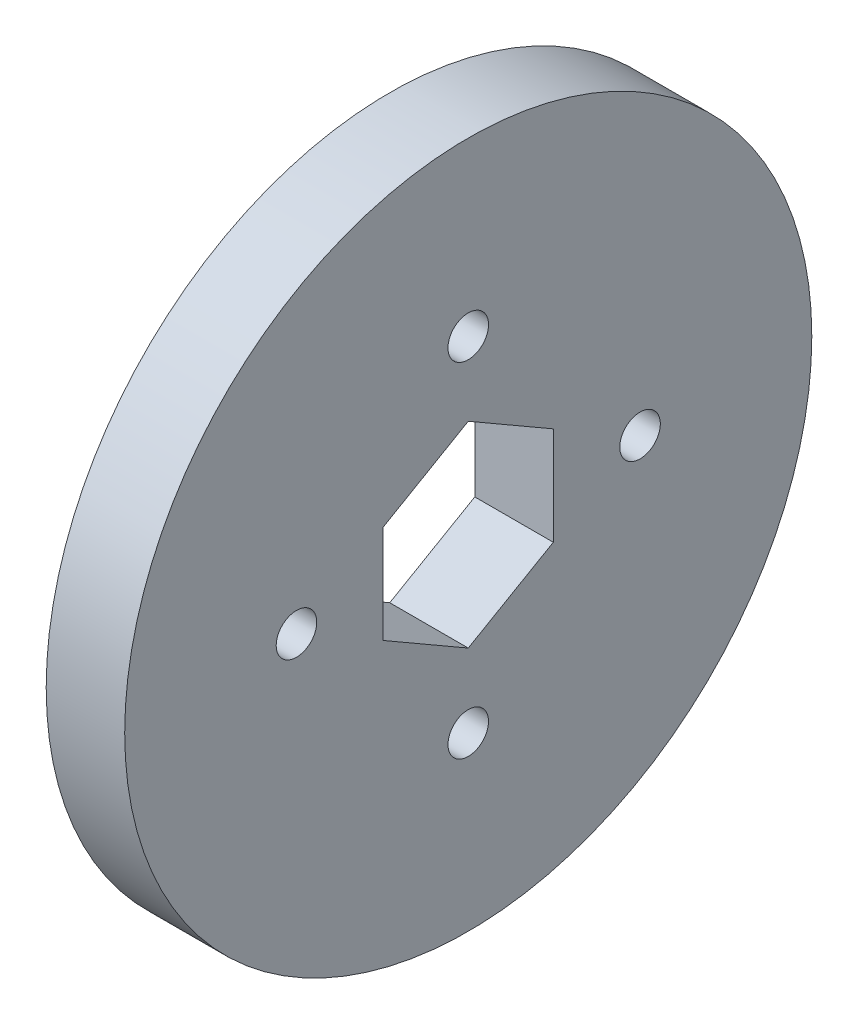
ISO-10303-21;
HEADER;
FILE_DESCRIPTION(('STEP AP214'),'2;1');
FILE_NAME('part.step','',(''),(''),'','','');
FILE_SCHEMA(('AUTOMOTIVE_DESIGN { 1 0 10303 214 1 1 1 1 }'));
ENDSEC;
DATA;
#1=APPLICATION_CONTEXT('core data for automotive mechanical design processes');
#2=APPLICATION_PROTOCOL_DEFINITION('international standard','automotive_design',2000,#1);
#3=PRODUCT_CONTEXT('',#1,'mechanical');
#4=PRODUCT('Part','Part','',(#3));
#5=PRODUCT_RELATED_PRODUCT_CATEGORY('part','',(#4));
#6=PRODUCT_DEFINITION_FORMATION('','',#4);
#7=PRODUCT_DEFINITION_CONTEXT('part definition',#1,'design');
#8=PRODUCT_DEFINITION('design','',#6,#7);
#9=PRODUCT_DEFINITION_SHAPE('','',#8);
#10=(LENGTH_UNIT() NAMED_UNIT(*) SI_UNIT(.MILLI.,.METRE.));
#11=(NAMED_UNIT(*) PLANE_ANGLE_UNIT() SI_UNIT($,.RADIAN.));
#12=(NAMED_UNIT(*) SI_UNIT($,.STERADIAN.) SOLID_ANGLE_UNIT());
#13=UNCERTAINTY_MEASURE_WITH_UNIT(LENGTH_MEASURE(1.E-05),#10,'distance_accuracy_value','');
#14=(GEOMETRIC_REPRESENTATION_CONTEXT(3) GLOBAL_UNCERTAINTY_ASSIGNED_CONTEXT((#13)) GLOBAL_UNIT_ASSIGNED_CONTEXT((#10,
#11,#12)) REPRESENTATION_CONTEXT('',''));
#15=CARTESIAN_POINT('',(0.,0.,0.));
#16=DIRECTION('',(0.,0.,1.));
#17=DIRECTION('',(1.,0.,0.));
#18=AXIS2_PLACEMENT_3D('',#15,#16,#17);
#19=CARTESIAN_POINT('',(-6.,-58.5459620006682,16.0977600055791));
#20=DIRECTION('',(-1.,0.,0.));
#21=DIRECTION('',(0.,0.,1.));
#22=AXIS2_PLACEMENT_3D('',#19,#20,#21);
#23=PLANE('',#22);
#24=CARTESIAN_POINT('',(-6.,-58.5459620006684,2.96898563883479));
#25=DIRECTION('',(-1.,0.,0.));
#26=DIRECTION('',(0.,0.,1.));
#27=AXIS2_PLACEMENT_3D('',#24,#25,#26);
#28=CIRCLE('',#27,1.54999999999999);
#29=CARTESIAN_POINT('',(-6.,-58.5459620006684,4.51898563883478));
#30=VERTEX_POINT('',#29);
#31=EDGE_CURVE('E142',#30,#30,#28,.T.);
#32=ORIENTED_EDGE('',*,*,#31,.F.);
#33=EDGE_LOOP('',(#32));
#34=FACE_BOUND('',#33,.T.);
#35=CARTESIAN_POINT('',(-6.,-58.5459620006679,29.2265343723235));
#36=DIRECTION('',(-1.,0.,0.));
#37=DIRECTION('',(0.,0.,1.));
#38=AXIS2_PLACEMENT_3D('',#35,#36,#37);
#39=CIRCLE('',#38,1.55000000000001);
#40=CARTESIAN_POINT('',(-6.,-58.5459620006679,30.7765343723235));
#41=VERTEX_POINT('',#40);
#42=EDGE_CURVE('E154',#41,#41,#39,.T.);
#43=ORIENTED_EDGE('',*,*,#42,.F.);
#44=EDGE_LOOP('',(#43));
#45=FACE_BOUND('',#44,.T.);
#46=CARTESIAN_POINT('',(-6.,-58.5459620006682,16.0977600055791));
#47=DIRECTION('',(-1.,0.,0.));
#48=DIRECTION('',(0.,0.,1.));
#49=AXIS2_PLACEMENT_3D('',#46,#47,#48);
#50=CIRCLE('',#49,26.2575490314848);
#51=CARTESIAN_POINT('',(-6.,-58.5459620006682,42.3553090370639));
#52=VERTEX_POINT('',#51);
#53=EDGE_CURVE('E11',#52,#52,#50,.T.);
#54=ORIENTED_EDGE('',*,*,#53,.T.);
#55=EDGE_LOOP('',(#54));
#56=FACE_BOUND('',#55,.T.);
#57=CARTESIAN_POINT('',(-6.,-45.4171876339238,16.0977600055789));
#58=DIRECTION('',(-1.,0.,0.));
#59=DIRECTION('',(0.,0.,1.));
#60=AXIS2_PLACEMENT_3D('',#57,#58,#59);
#61=CIRCLE('',#60,1.54999999999999);
#62=CARTESIAN_POINT('',(-6.,-45.4171876339238,17.6477600055789));
#63=VERTEX_POINT('',#62);
#64=EDGE_CURVE('E148',#63,#63,#61,.T.);
#65=ORIENTED_EDGE('',*,*,#64,.F.);
#66=EDGE_LOOP('',(#65));
#67=FACE_BOUND('',#66,.T.);
#68=CARTESIAN_POINT('',(-6.,-71.6747363674125,16.0977600055793));
#69=DIRECTION('',(-1.,0.,0.));
#70=DIRECTION('',(0.,0.,1.));
#71=AXIS2_PLACEMENT_3D('',#68,#69,#70);
#72=CIRCLE('',#71,1.55);
#73=CARTESIAN_POINT('',(-6.,-71.6747363674125,17.6477600055793));
#74=VERTEX_POINT('',#73);
#75=EDGE_CURVE('E136',#74,#74,#72,.T.);
#76=ORIENTED_EDGE('',*,*,#75,.F.);
#77=EDGE_LOOP('',(#76));
#78=FACE_BOUND('',#77,.T.);
#79=DIRECTION('',(0.,-0.500000000000014,-0.866025403784431));
#80=VECTOR('',#79,1.);
#81=CARTESIAN_POINT('',(-6.,-51.040408501203,16.097760005579));
#82=LINE('',#81,#80);
#83=CARTESIAN_POINT('',(-6.,-51.040408501203,16.097760005579));
#84=VERTEX_POINT('',#83);
#85=CARTESIAN_POINT('',(-6.,-54.7931852509357,9.59776000557909));
#86=VERTEX_POINT('',#85);
#87=EDGE_CURVE('E93',#84,#86,#82,.T.);
#88=ORIENTED_EDGE('',*,*,#87,.F.);
#89=DIRECTION('',(0.,0.499999999999986,-0.866025403784447));
#90=VECTOR('',#89,1.);
#91=CARTESIAN_POINT('',(-6.,-54.7931852509355,22.5977600055791));
#92=LINE('',#91,#90);
#93=CARTESIAN_POINT('',(-6.,-54.7931852509355,22.5977600055791));
#94=VERTEX_POINT('',#93);
#95=EDGE_CURVE('E85',#94,#84,#92,.T.);
#96=ORIENTED_EDGE('',*,*,#95,.F.);
#97=DIRECTION('',(0.,1.,0.));
#98=VECTOR('',#97,1.);
#99=CARTESIAN_POINT('',(-6.,-62.2987387504006,22.5977600055792));
#100=LINE('',#99,#98);
#101=CARTESIAN_POINT('',(-6.,-62.2987387504006,22.5977600055792));
#102=VERTEX_POINT('',#101);
#103=EDGE_CURVE('E114',#102,#94,#100,.T.);
#104=ORIENTED_EDGE('',*,*,#103,.F.);
#105=DIRECTION('',(0.,0.500000000000014,0.866025403784431));
#106=VECTOR('',#105,1.);
#107=CARTESIAN_POINT('',(-6.,-66.0515155001333,16.0977600055793));
#108=LINE('',#107,#106);
#109=CARTESIAN_POINT('',(-6.,-66.0515155001333,16.0977600055793));
#110=VERTEX_POINT('',#109);
#111=EDGE_CURVE('E112',#110,#102,#108,.T.);
#112=ORIENTED_EDGE('',*,*,#111,.F.);
#113=DIRECTION('',(0.,-0.499999999999987,0.866025403784446));
#114=VECTOR('',#113,1.);
#115=CARTESIAN_POINT('',(-6.,-62.2987387504008,9.5977600055792));
#116=LINE('',#115,#114);
#117=CARTESIAN_POINT('',(-6.,-62.2987387504008,9.5977600055792));
#118=VERTEX_POINT('',#117);
#119=EDGE_CURVE('E108',#118,#110,#116,.T.);
#120=ORIENTED_EDGE('',*,*,#119,.F.);
#121=DIRECTION('',(0.,-1.,0.));
#122=VECTOR('',#121,1.);
#123=CARTESIAN_POINT('',(-6.,-54.7931852509357,9.59776000557909));
#124=LINE('',#123,#122);
#125=EDGE_CURVE('E106',#86,#118,#124,.T.);
#126=ORIENTED_EDGE('',*,*,#125,.F.);
#127=EDGE_LOOP('',(#88,#96,#104,#112,#120,#126));
#128=FACE_BOUND('',#127,.T.);
#129=ADVANCED_FACE('F32',(#34,#45,#56,#67,#78,#128),#23,.T.);
#130=CARTESIAN_POINT('',(0.,-58.5459620006682,16.0977600055791));
#131=DIRECTION('',(-1.,0.,0.));
#132=DIRECTION('',(0.,0.,1.));
#133=AXIS2_PLACEMENT_3D('',#130,#131,#132);
#134=PLANE('',#133);
#135=CARTESIAN_POINT('',(0.,-71.6747363674125,16.0977600055793));
#136=DIRECTION('',(-1.,0.,0.));
#137=DIRECTION('',(0.,0.,1.));
#138=AXIS2_PLACEMENT_3D('',#135,#136,#137);
#139=CIRCLE('',#138,1.55);
#140=CARTESIAN_POINT('',(0.,-71.6747363674125,17.6477600055793));
#141=VERTEX_POINT('',#140);
#142=EDGE_CURVE('E101',#141,#141,#139,.T.);
#143=ORIENTED_EDGE('',*,*,#142,.T.);
#144=EDGE_LOOP('',(#143));
#145=FACE_BOUND('',#144,.T.);
#146=CARTESIAN_POINT('',(0.,-58.5459620006684,2.96898563883479));
#147=DIRECTION('',(-1.,0.,0.));
#148=DIRECTION('',(0.,0.,1.));
#149=AXIS2_PLACEMENT_3D('',#146,#147,#148);
#150=CIRCLE('',#149,1.54999999999999);
#151=CARTESIAN_POINT('',(0.,-58.5459620006684,4.51898563883478));
#152=VERTEX_POINT('',#151);
#153=EDGE_CURVE('E139',#152,#152,#150,.T.);
#154=ORIENTED_EDGE('',*,*,#153,.T.);
#155=EDGE_LOOP('',(#154));
#156=FACE_BOUND('',#155,.T.);
#157=CARTESIAN_POINT('',(0.,-45.4171876339238,16.0977600055789));
#158=DIRECTION('',(-1.,0.,0.));
#159=DIRECTION('',(0.,0.,1.));
#160=AXIS2_PLACEMENT_3D('',#157,#158,#159);
#161=CIRCLE('',#160,1.54999999999999);
#162=CARTESIAN_POINT('',(0.,-45.4171876339238,17.6477600055789));
#163=VERTEX_POINT('',#162);
#164=EDGE_CURVE('E145',#163,#163,#161,.T.);
#165=ORIENTED_EDGE('',*,*,#164,.T.);
#166=EDGE_LOOP('',(#165));
#167=FACE_BOUND('',#166,.T.);
#168=CARTESIAN_POINT('',(0.,-58.5459620006679,29.2265343723235));
#169=DIRECTION('',(-1.,0.,0.));
#170=DIRECTION('',(0.,0.,1.));
#171=AXIS2_PLACEMENT_3D('',#168,#169,#170);
#172=CIRCLE('',#171,1.55000000000001);
#173=CARTESIAN_POINT('',(0.,-58.5459620006679,30.7765343723235));
#174=VERTEX_POINT('',#173);
#175=EDGE_CURVE('E151',#174,#174,#172,.T.);
#176=ORIENTED_EDGE('',*,*,#175,.T.);
#177=EDGE_LOOP('',(#176));
#178=FACE_BOUND('',#177,.T.);
#179=CARTESIAN_POINT('',(0.,-58.5459620006682,16.0977600055791));
#180=DIRECTION('',(-1.,0.,0.));
#181=DIRECTION('',(0.,0.,1.));
#182=AXIS2_PLACEMENT_3D('',#179,#180,#181);
#183=CIRCLE('',#182,26.2575490314848);
#184=CARTESIAN_POINT('',(0.,-58.5459620006682,42.3553090370639));
#185=VERTEX_POINT('',#184);
#186=EDGE_CURVE('E36',#185,#185,#183,.T.);
#187=ORIENTED_EDGE('',*,*,#186,.F.);
#188=EDGE_LOOP('',(#187));
#189=FACE_BOUND('',#188,.T.);
#190=DIRECTION('',(0.,0.499999999999986,-0.866025403784447));
#191=VECTOR('',#190,1.);
#192=CARTESIAN_POINT('',(0.,-54.7931852509355,22.5977600055791));
#193=LINE('',#192,#191);
#194=CARTESIAN_POINT('',(0.,-54.7931852509355,22.5977600055791));
#195=VERTEX_POINT('',#194);
#196=CARTESIAN_POINT('',(0.,-51.040408501203,16.097760005579));
#197=VERTEX_POINT('',#196);
#198=EDGE_CURVE('E55',#195,#197,#193,.T.);
#199=ORIENTED_EDGE('',*,*,#198,.T.);
#200=DIRECTION('',(0.,-0.500000000000014,-0.866025403784431));
#201=VECTOR('',#200,1.);
#202=CARTESIAN_POINT('',(0.,-51.040408501203,16.097760005579));
#203=LINE('',#202,#201);
#204=CARTESIAN_POINT('',(0.,-54.7931852509357,9.59776000557909));
#205=VERTEX_POINT('',#204);
#206=EDGE_CURVE('E100',#197,#205,#203,.T.);
#207=ORIENTED_EDGE('',*,*,#206,.T.);
#208=DIRECTION('',(0.,-1.,0.));
#209=VECTOR('',#208,1.);
#210=CARTESIAN_POINT('',(0.,-54.7931852509357,9.59776000557909));
#211=LINE('',#210,#209);
#212=CARTESIAN_POINT('',(0.,-62.2987387504008,9.5977600055792));
#213=VERTEX_POINT('',#212);
#214=EDGE_CURVE('E118',#205,#213,#211,.T.);
#215=ORIENTED_EDGE('',*,*,#214,.T.);
#216=DIRECTION('',(0.,-0.499999999999987,0.866025403784446));
#217=VECTOR('',#216,1.);
#218=CARTESIAN_POINT('',(0.,-62.2987387504008,9.5977600055792));
#219=LINE('',#218,#217);
#220=CARTESIAN_POINT('',(0.,-66.0515155001333,16.0977600055793));
#221=VERTEX_POINT('',#220);
#222=EDGE_CURVE('E121',#213,#221,#219,.T.);
#223=ORIENTED_EDGE('',*,*,#222,.T.);
#224=DIRECTION('',(0.,0.500000000000014,0.866025403784431));
#225=VECTOR('',#224,1.);
#226=CARTESIAN_POINT('',(0.,-66.0515155001333,16.0977600055793));
#227=LINE('',#226,#225);
#228=CARTESIAN_POINT('',(0.,-62.2987387504006,22.5977600055792));
#229=VERTEX_POINT('',#228);
#230=EDGE_CURVE('E124',#221,#229,#227,.T.);
#231=ORIENTED_EDGE('',*,*,#230,.T.);
#232=DIRECTION('',(0.,1.,0.));
#233=VECTOR('',#232,1.);
#234=CARTESIAN_POINT('',(0.,-62.2987387504006,22.5977600055792));
#235=LINE('',#234,#233);
#236=EDGE_CURVE('E94',#229,#195,#235,.T.);
#237=ORIENTED_EDGE('',*,*,#236,.T.);
#238=EDGE_LOOP('',(#199,#207,#215,#223,#231,#237));
#239=FACE_BOUND('',#238,.T.);
#240=ADVANCED_FACE('F160',(#145,#156,#167,#178,#189,#239),#134,.F.);
#241=CARTESIAN_POINT('',(-6.,-58.5459620006682,16.0977600055791));
#242=DIRECTION('',(1.,0.,0.));
#243=DIRECTION('',(0.,0.,-1.));
#244=AXIS2_PLACEMENT_3D('',#241,#242,#243);
#245=CYLINDRICAL_SURFACE('',#244,26.2575490314848);
#246=ORIENTED_EDGE('',*,*,#53,.F.);
#247=EDGE_LOOP('',(#246));
#248=FACE_BOUND('',#247,.T.);
#249=ORIENTED_EDGE('',*,*,#186,.T.);
#250=EDGE_LOOP('',(#249));
#251=FACE_BOUND('',#250,.T.);
#252=ADVANCED_FACE('F34',(#248,#251),#245,.T.);
#253=CARTESIAN_POINT('',(-6.,-58.5459620006679,29.2265343723235));
#254=DIRECTION('',(1.,0.,0.));
#255=DIRECTION('',(0.,0.,-1.));
#256=AXIS2_PLACEMENT_3D('',#253,#254,#255);
#257=CYLINDRICAL_SURFACE('',#256,1.55000000000001);
#258=ORIENTED_EDGE('',*,*,#42,.T.);
#259=EDGE_LOOP('',(#258));
#260=FACE_BOUND('',#259,.T.);
#261=ORIENTED_EDGE('',*,*,#175,.F.);
#262=EDGE_LOOP('',(#261));
#263=FACE_BOUND('',#262,.T.);
#264=ADVANCED_FACE('F163',(#260,#263),#257,.F.);
#265=CARTESIAN_POINT('',(-6.,-45.4171876339238,16.0977600055789));
#266=DIRECTION('',(1.,0.,0.));
#267=DIRECTION('',(0.,0.,-1.));
#268=AXIS2_PLACEMENT_3D('',#265,#266,#267);
#269=CYLINDRICAL_SURFACE('',#268,1.54999999999999);
#270=ORIENTED_EDGE('',*,*,#64,.T.);
#271=EDGE_LOOP('',(#270));
#272=FACE_BOUND('',#271,.T.);
#273=ORIENTED_EDGE('',*,*,#164,.F.);
#274=EDGE_LOOP('',(#273));
#275=FACE_BOUND('',#274,.T.);
#276=ADVANCED_FACE('F165',(#272,#275),#269,.F.);
#277=CARTESIAN_POINT('',(-6.,-58.5459620006684,2.96898563883479));
#278=DIRECTION('',(1.,0.,0.));
#279=DIRECTION('',(0.,0.,-1.));
#280=AXIS2_PLACEMENT_3D('',#277,#278,#279);
#281=CYLINDRICAL_SURFACE('',#280,1.54999999999999);
#282=ORIENTED_EDGE('',*,*,#31,.T.);
#283=EDGE_LOOP('',(#282));
#284=FACE_BOUND('',#283,.T.);
#285=ORIENTED_EDGE('',*,*,#153,.F.);
#286=EDGE_LOOP('',(#285));
#287=FACE_BOUND('',#286,.T.);
#288=ADVANCED_FACE('F172',(#284,#287),#281,.F.);
#289=CARTESIAN_POINT('',(-6.,-71.6747363674125,16.0977600055793));
#290=DIRECTION('',(1.,0.,0.));
#291=DIRECTION('',(0.,0.,-1.));
#292=AXIS2_PLACEMENT_3D('',#289,#290,#291);
#293=CYLINDRICAL_SURFACE('',#292,1.55);
#294=ORIENTED_EDGE('',*,*,#75,.T.);
#295=EDGE_LOOP('',(#294));
#296=FACE_BOUND('',#295,.T.);
#297=ORIENTED_EDGE('',*,*,#142,.F.);
#298=EDGE_LOOP('',(#297));
#299=FACE_BOUND('',#298,.T.);
#300=ADVANCED_FACE('F193',(#296,#299),#293,.F.);
#301=CARTESIAN_POINT('',(-6.,-54.7931852509355,22.5977600055791));
#302=DIRECTION('',(0.,-0.866025403784446,-0.499999999999986));
#303=DIRECTION('',(0.,0.499999999999986,-0.866025403784447));
#304=AXIS2_PLACEMENT_3D('',#301,#302,#303);
#305=PLANE('',#304);
#306=ORIENTED_EDGE('',*,*,#198,.F.);
#307=DIRECTION('',(1.,0.,0.));
#308=VECTOR('',#307,1.);
#309=CARTESIAN_POINT('',(-6.,-54.7931852509355,22.5977600055791));
#310=LINE('',#309,#308);
#311=EDGE_CURVE('E89',#94,#195,#310,.T.);
#312=ORIENTED_EDGE('',*,*,#311,.F.);
#313=ORIENTED_EDGE('',*,*,#95,.T.);
#314=DIRECTION('',(1.,0.,0.));
#315=VECTOR('',#314,1.);
#316=CARTESIAN_POINT('',(-6.,-51.040408501203,16.097760005579));
#317=LINE('',#316,#315);
#318=EDGE_CURVE('E88',#84,#197,#317,.T.);
#319=ORIENTED_EDGE('',*,*,#318,.T.);
#320=EDGE_LOOP('',(#306,#312,#313,#319));
#321=FACE_BOUND('',#320,.T.);
#322=ADVANCED_FACE('F87',(#321),#305,.T.);
#323=CARTESIAN_POINT('',(-6.,-51.040408501203,16.097760005579));
#324=DIRECTION('',(0.,-0.866025403784431,0.500000000000014));
#325=DIRECTION('',(0.,-0.500000000000014,-0.866025403784431));
#326=AXIS2_PLACEMENT_3D('',#323,#324,#325);
#327=PLANE('',#326);
#328=ORIENTED_EDGE('',*,*,#206,.F.);
#329=ORIENTED_EDGE('',*,*,#318,.F.);
#330=ORIENTED_EDGE('',*,*,#87,.T.);
#331=DIRECTION('',(1.,0.,0.));
#332=VECTOR('',#331,1.);
#333=CARTESIAN_POINT('',(-6.,-54.7931852509357,9.59776000557909));
#334=LINE('',#333,#332);
#335=EDGE_CURVE('E102',#86,#205,#334,.T.);
#336=ORIENTED_EDGE('',*,*,#335,.T.);
#337=EDGE_LOOP('',(#328,#329,#330,#336));
#338=FACE_BOUND('',#337,.T.);
#339=ADVANCED_FACE('F97',(#338),#327,.T.);
#340=CARTESIAN_POINT('',(-6.,-54.7931852509357,9.59776000557909));
#341=DIRECTION('',(0.,0.,1.));
#342=DIRECTION('',(0.,-1.,0.));
#343=AXIS2_PLACEMENT_3D('',#340,#341,#342);
#344=PLANE('',#343);
#345=ORIENTED_EDGE('',*,*,#214,.F.);
#346=ORIENTED_EDGE('',*,*,#335,.F.);
#347=ORIENTED_EDGE('',*,*,#125,.T.);
#348=DIRECTION('',(1.,0.,0.));
#349=VECTOR('',#348,1.);
#350=CARTESIAN_POINT('',(-6.,-62.2987387504008,9.5977600055792));
#351=LINE('',#350,#349);
#352=EDGE_CURVE('E133',#118,#213,#351,.T.);
#353=ORIENTED_EDGE('',*,*,#352,.T.);
#354=EDGE_LOOP('',(#345,#346,#347,#353));
#355=FACE_BOUND('',#354,.T.);
#356=ADVANCED_FACE('F214',(#355),#344,.T.);
#357=CARTESIAN_POINT('',(-6.,-62.2987387504008,9.5977600055792));
#358=DIRECTION('',(0.,0.866025403784446,0.499999999999987));
#359=DIRECTION('',(0.,-0.499999999999987,0.866025403784446));
#360=AXIS2_PLACEMENT_3D('',#357,#358,#359);
#361=PLANE('',#360);
#362=ORIENTED_EDGE('',*,*,#222,.F.);
#363=ORIENTED_EDGE('',*,*,#352,.F.);
#364=ORIENTED_EDGE('',*,*,#119,.T.);
#365=DIRECTION('',(1.,0.,0.));
#366=VECTOR('',#365,1.);
#367=CARTESIAN_POINT('',(-6.,-66.0515155001333,16.0977600055793));
#368=LINE('',#367,#366);
#369=EDGE_CURVE('E131',#110,#221,#368,.T.);
#370=ORIENTED_EDGE('',*,*,#369,.T.);
#371=EDGE_LOOP('',(#362,#363,#364,#370));
#372=FACE_BOUND('',#371,.T.);
#373=ADVANCED_FACE('F217',(#372),#361,.T.);
#374=CARTESIAN_POINT('',(-6.,-66.0515155001333,16.0977600055793));
#375=DIRECTION('',(0.,0.86602540378443,-0.500000000000014));
#376=DIRECTION('',(0.,0.500000000000014,0.866025403784431));
#377=AXIS2_PLACEMENT_3D('',#374,#375,#376);
#378=PLANE('',#377);
#379=ORIENTED_EDGE('',*,*,#230,.F.);
#380=ORIENTED_EDGE('',*,*,#369,.F.);
#381=ORIENTED_EDGE('',*,*,#111,.T.);
#382=DIRECTION('',(1.,0.,0.));
#383=VECTOR('',#382,1.);
#384=CARTESIAN_POINT('',(-6.,-62.2987387504006,22.5977600055792));
#385=LINE('',#384,#383);
#386=EDGE_CURVE('E47',#102,#229,#385,.T.);
#387=ORIENTED_EDGE('',*,*,#386,.T.);
#388=EDGE_LOOP('',(#379,#380,#381,#387));
#389=FACE_BOUND('',#388,.T.);
#390=ADVANCED_FACE('F221',(#389),#378,.T.);
#391=CARTESIAN_POINT('',(-6.,-62.2987387504006,22.5977600055792));
#392=DIRECTION('',(0.,0.,-1.));
#393=DIRECTION('',(0.,1.,0.));
#394=AXIS2_PLACEMENT_3D('',#391,#392,#393);
#395=PLANE('',#394);
#396=ORIENTED_EDGE('',*,*,#236,.F.);
#397=ORIENTED_EDGE('',*,*,#386,.F.);
#398=ORIENTED_EDGE('',*,*,#103,.T.);
#399=ORIENTED_EDGE('',*,*,#311,.T.);
#400=EDGE_LOOP('',(#396,#397,#398,#399));
#401=FACE_BOUND('',#400,.T.);
#402=ADVANCED_FACE('F225',(#401),#395,.T.);
#403=CLOSED_SHELL('',(#129,#240,#252,#264,#276,#288,#300,#322,#339,#356,#373,#390,#402));
#404=MANIFOLD_SOLID_BREP('B2',#403);
#405=ADVANCED_BREP_SHAPE_REPRESENTATION('',(#18,#404),#14);
#406=SHAPE_DEFINITION_REPRESENTATION(#9,#405);
ENDSEC;
END-ISO-10303-21;
